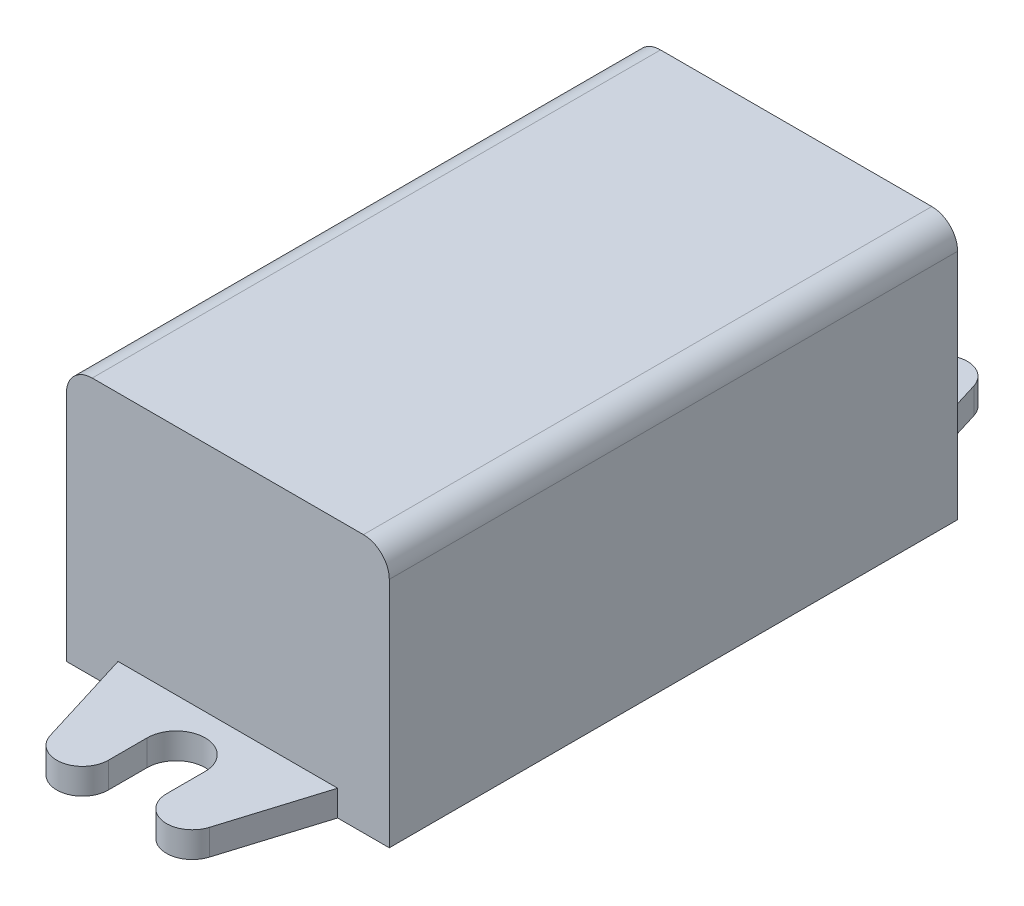
ISO-10303-21;
HEADER;
FILE_DESCRIPTION(('STEP AP214'),'2;1');
FILE_NAME('part.step','',(''),(''),'','','');
FILE_SCHEMA(('AUTOMOTIVE_DESIGN { 1 0 10303 214 1 1 1 1 }'));
ENDSEC;
DATA;
#1=APPLICATION_CONTEXT('core data for automotive mechanical design processes');
#2=APPLICATION_PROTOCOL_DEFINITION('international standard','automotive_design',2000,#1);
#3=PRODUCT_CONTEXT('',#1,'mechanical');
#4=PRODUCT('Part','Part','',(#3));
#5=PRODUCT_RELATED_PRODUCT_CATEGORY('part','',(#4));
#6=PRODUCT_DEFINITION_FORMATION('','',#4);
#7=PRODUCT_DEFINITION_CONTEXT('part definition',#1,'design');
#8=PRODUCT_DEFINITION('design','',#6,#7);
#9=PRODUCT_DEFINITION_SHAPE('','',#8);
#10=(LENGTH_UNIT() NAMED_UNIT(*) SI_UNIT(.MILLI.,.METRE.));
#11=(NAMED_UNIT(*) PLANE_ANGLE_UNIT() SI_UNIT($,.RADIAN.));
#12=(NAMED_UNIT(*) SI_UNIT($,.STERADIAN.) SOLID_ANGLE_UNIT());
#13=UNCERTAINTY_MEASURE_WITH_UNIT(LENGTH_MEASURE(1.E-05),#10,'distance_accuracy_value','');
#14=(GEOMETRIC_REPRESENTATION_CONTEXT(3) GLOBAL_UNCERTAINTY_ASSIGNED_CONTEXT((#13)) GLOBAL_UNIT_ASSIGNED_CONTEXT((#10,
#11,#12)) REPRESENTATION_CONTEXT('',''));
#15=CARTESIAN_POINT('',(0.,0.,0.));
#16=DIRECTION('',(0.,0.,1.));
#17=DIRECTION('',(1.,0.,0.));
#18=AXIS2_PLACEMENT_3D('',#15,#16,#17);
#19=CARTESIAN_POINT('',(0.,0.,-22.));
#20=DIRECTION('',(0.,0.,1.));
#21=DIRECTION('',(1.,0.,0.));
#22=AXIS2_PLACEMENT_3D('',#19,#20,#21);
#23=PLANE('',#22);
#24=DIRECTION('',(0.,-1.,0.));
#25=VECTOR('',#24,1.);
#26=CARTESIAN_POINT('',(-12.5,10.,-22.));
#27=LINE('',#26,#25);
#28=CARTESIAN_POINT('',(-12.5,8.,-22.));
#29=VERTEX_POINT('',#28);
#30=CARTESIAN_POINT('',(-12.5,-10.,-22.));
#31=VERTEX_POINT('',#30);
#32=EDGE_CURVE('E340',#29,#31,#27,.T.);
#33=ORIENTED_EDGE('',*,*,#32,.F.);
#34=CARTESIAN_POINT('',(-10.5,8.,-22.));
#35=DIRECTION('',(0.,0.,1.));
#36=DIRECTION('',(1.,0.,0.));
#37=AXIS2_PLACEMENT_3D('',#34,#35,#36);
#38=CIRCLE('',#37,2.);
#39=CARTESIAN_POINT('',(-10.5,10.,-22.));
#40=VERTEX_POINT('',#39);
#41=EDGE_CURVE('E355',#29,#40,#38,.F.);
#42=ORIENTED_EDGE('',*,*,#41,.T.);
#43=DIRECTION('',(-1.,0.,0.));
#44=VECTOR('',#43,1.);
#45=CARTESIAN_POINT('',(-12.5,10.,-22.));
#46=LINE('',#45,#44);
#47=CARTESIAN_POINT('',(10.5,10.,-22.));
#48=VERTEX_POINT('',#47);
#49=EDGE_CURVE('E338',#48,#40,#46,.T.);
#50=ORIENTED_EDGE('',*,*,#49,.F.);
#51=CARTESIAN_POINT('',(10.5,8.,-22.));
#52=DIRECTION('',(0.,0.,1.));
#53=DIRECTION('',(1.,0.,0.));
#54=AXIS2_PLACEMENT_3D('',#51,#52,#53);
#55=CIRCLE('',#54,2.);
#56=CARTESIAN_POINT('',(12.5,8.,-22.));
#57=VERTEX_POINT('',#56);
#58=EDGE_CURVE('E353',#48,#57,#55,.F.);
#59=ORIENTED_EDGE('',*,*,#58,.T.);
#60=DIRECTION('',(0.,1.,0.));
#61=VECTOR('',#60,1.);
#62=CARTESIAN_POINT('',(12.5,10.,-22.));
#63=LINE('',#62,#61);
#64=CARTESIAN_POINT('',(12.5,-10.,-22.));
#65=VERTEX_POINT('',#64);
#66=EDGE_CURVE('E310',#65,#57,#63,.T.);
#67=ORIENTED_EDGE('',*,*,#66,.F.);
#68=DIRECTION('',(1.,0.,0.));
#69=VECTOR('',#68,1.);
#70=CARTESIAN_POINT('',(-12.5,-10.,-22.));
#71=LINE('',#70,#69);
#72=CARTESIAN_POINT('',(8.5,-10.,-22.));
#73=VERTEX_POINT('',#72);
#74=EDGE_CURVE('E342',#73,#65,#71,.T.);
#75=ORIENTED_EDGE('',*,*,#74,.F.);
#76=DIRECTION('',(0.,-1.,0.));
#77=VECTOR('',#76,1.);
#78=CARTESIAN_POINT('',(8.5,-8.,-22.));
#79=LINE('',#78,#77);
#80=CARTESIAN_POINT('',(8.5,-8.,-22.));
#81=VERTEX_POINT('',#80);
#82=EDGE_CURVE('E308',#81,#73,#79,.T.);
#83=ORIENTED_EDGE('',*,*,#82,.F.);
#84=DIRECTION('',(-1.,0.,0.));
#85=VECTOR('',#84,1.);
#86=CARTESIAN_POINT('',(-8.5,-8.,-22.));
#87=LINE('',#86,#85);
#88=CARTESIAN_POINT('',(-8.5,-8.,-22.));
#89=VERTEX_POINT('',#88);
#90=EDGE_CURVE('E263',#81,#89,#87,.T.);
#91=ORIENTED_EDGE('',*,*,#90,.T.);
#92=DIRECTION('',(0.,-1.,0.));
#93=VECTOR('',#92,1.);
#94=CARTESIAN_POINT('',(-8.5,-8.,-22.));
#95=LINE('',#94,#93);
#96=CARTESIAN_POINT('',(-8.5,-10.,-22.));
#97=VERTEX_POINT('',#96);
#98=EDGE_CURVE('E288',#89,#97,#95,.T.);
#99=ORIENTED_EDGE('',*,*,#98,.T.);
#100=EDGE_CURVE('E328',#31,#97,#71,.T.);
#101=ORIENTED_EDGE('',*,*,#100,.F.);
#102=EDGE_LOOP('',(#33,#42,#50,#59,#67,#75,#83,#91,#99,#101));
#103=FACE_BOUND('',#102,.T.);
#104=ADVANCED_FACE('F38',(#103),#23,.F.);
#105=CARTESIAN_POINT('',(12.5,10.,22.));
#106=DIRECTION('',(-1.,0.,0.));
#107=DIRECTION('',(0.,0.,1.));
#108=AXIS2_PLACEMENT_3D('',#105,#106,#107);
#109=PLANE('',#108);
#110=ORIENTED_EDGE('',*,*,#66,.T.);
#111=DIRECTION('',(0.,0.,-1.));
#112=VECTOR('',#111,1.);
#113=CARTESIAN_POINT('',(12.5,8.,22.));
#114=LINE('',#113,#112);
#115=CARTESIAN_POINT('',(12.5,8.,22.));
#116=VERTEX_POINT('',#115);
#117=EDGE_CURVE('E11',#57,#116,#114,.F.);
#118=ORIENTED_EDGE('',*,*,#117,.T.);
#119=DIRECTION('',(0.,1.,0.));
#120=VECTOR('',#119,1.);
#121=CARTESIAN_POINT('',(12.5,10.,22.));
#122=LINE('',#121,#120);
#123=CARTESIAN_POINT('',(12.5,-10.,22.));
#124=VERTEX_POINT('',#123);
#125=EDGE_CURVE('E325',#124,#116,#122,.T.);
#126=ORIENTED_EDGE('',*,*,#125,.F.);
#127=DIRECTION('',(0.,0.,-1.));
#128=VECTOR('',#127,1.);
#129=CARTESIAN_POINT('',(12.5,-10.,22.));
#130=LINE('',#129,#128);
#131=EDGE_CURVE('E336',#124,#65,#130,.T.);
#132=ORIENTED_EDGE('',*,*,#131,.T.);
#133=EDGE_LOOP('',(#110,#118,#126,#132));
#134=FACE_BOUND('',#133,.T.);
#135=ADVANCED_FACE('F383',(#134),#109,.F.);
#136=CARTESIAN_POINT('',(-12.5,10.,22.));
#137=DIRECTION('',(0.,-1.,0.));
#138=DIRECTION('',(0.,0.,-1.));
#139=AXIS2_PLACEMENT_3D('',#136,#137,#138);
#140=PLANE('',#139);
#141=ORIENTED_EDGE('',*,*,#49,.T.);
#142=DIRECTION('',(0.,0.,-1.));
#143=VECTOR('',#142,1.);
#144=CARTESIAN_POINT('',(-10.5,10.,22.));
#145=LINE('',#144,#143);
#146=CARTESIAN_POINT('',(-10.5,10.,22.));
#147=VERTEX_POINT('',#146);
#148=EDGE_CURVE('E59',#40,#147,#145,.F.);
#149=ORIENTED_EDGE('',*,*,#148,.T.);
#150=DIRECTION('',(-1.,0.,0.));
#151=VECTOR('',#150,1.);
#152=CARTESIAN_POINT('',(-12.5,10.,22.));
#153=LINE('',#152,#151);
#154=CARTESIAN_POINT('',(10.5,10.,22.));
#155=VERTEX_POINT('',#154);
#156=EDGE_CURVE('E327',#155,#147,#153,.T.);
#157=ORIENTED_EDGE('',*,*,#156,.F.);
#158=DIRECTION('',(0.,0.,-1.));
#159=VECTOR('',#158,1.);
#160=CARTESIAN_POINT('',(10.5,10.,22.));
#161=LINE('',#160,#159);
#162=EDGE_CURVE('E357',#155,#48,#161,.T.);
#163=ORIENTED_EDGE('',*,*,#162,.T.);
#164=EDGE_LOOP('',(#141,#149,#157,#163));
#165=FACE_BOUND('',#164,.T.);
#166=ADVANCED_FACE('F377',(#165),#140,.F.);
#167=CARTESIAN_POINT('',(-12.5,10.,22.));
#168=DIRECTION('',(1.,0.,0.));
#169=DIRECTION('',(0.,0.,-1.));
#170=AXIS2_PLACEMENT_3D('',#167,#168,#169);
#171=PLANE('',#170);
#172=DIRECTION('',(0.,-1.,0.));
#173=VECTOR('',#172,1.);
#174=CARTESIAN_POINT('',(-12.5,10.,22.));
#175=LINE('',#174,#173);
#176=CARTESIAN_POINT('',(-12.5,8.,22.));
#177=VERTEX_POINT('',#176);
#178=CARTESIAN_POINT('',(-12.5,-10.,22.));
#179=VERTEX_POINT('',#178);
#180=EDGE_CURVE('E330',#177,#179,#175,.T.);
#181=ORIENTED_EDGE('',*,*,#180,.F.);
#182=DIRECTION('',(0.,0.,-1.));
#183=VECTOR('',#182,1.);
#184=CARTESIAN_POINT('',(-12.5,8.,22.));
#185=LINE('',#184,#183);
#186=EDGE_CURVE('E350',#177,#29,#185,.T.);
#187=ORIENTED_EDGE('',*,*,#186,.T.);
#188=ORIENTED_EDGE('',*,*,#32,.T.);
#189=DIRECTION('',(0.,0.,-1.));
#190=VECTOR('',#189,1.);
#191=CARTESIAN_POINT('',(-12.5,-10.,22.));
#192=LINE('',#191,#190);
#193=EDGE_CURVE('E347',#179,#31,#192,.T.);
#194=ORIENTED_EDGE('',*,*,#193,.F.);
#195=EDGE_LOOP('',(#181,#187,#188,#194));
#196=FACE_BOUND('',#195,.T.);
#197=ADVANCED_FACE('F370',(#196),#171,.F.);
#198=CARTESIAN_POINT('',(-12.5,-10.,22.));
#199=DIRECTION('',(0.,1.,0.));
#200=DIRECTION('',(-1.,0.,0.));
#201=AXIS2_PLACEMENT_3D('',#198,#199,#200);
#202=PLANE('',#201);
#203=ORIENTED_EDGE('',*,*,#100,.T.);
#204=DIRECTION('',(0.294502260880833,0.,-0.955650782627251));
#205=VECTOR('',#204,1.);
#206=CARTESIAN_POINT('',(-8.5,-10.,-22.));
#207=LINE('',#206,#205);
#208=CARTESIAN_POINT('',(-6.16130156525449,-10.,-29.5890045217617));
#209=VERTEX_POINT('',#208);
#210=EDGE_CURVE('E250',#97,#209,#207,.T.);
#211=ORIENTED_EDGE('',*,*,#210,.T.);
#212=CARTESIAN_POINT('',(-4.24999999999999,-10.,-29.));
#213=DIRECTION('',(0.,-1.,0.));
#214=DIRECTION('',(1.,0.,0.));
#215=AXIS2_PLACEMENT_3D('',#212,#213,#214);
#216=CIRCLE('',#215,2.);
#217=CARTESIAN_POINT('',(-2.24999999999999,-10.,-29.));
#218=VERTEX_POINT('',#217);
#219=EDGE_CURVE('E291',#209,#218,#216,.T.);
#220=ORIENTED_EDGE('',*,*,#219,.T.);
#221=DIRECTION('',(0.,0.,1.));
#222=VECTOR('',#221,1.);
#223=CARTESIAN_POINT('',(-2.24999999999999,-10.,-29.));
#224=LINE('',#223,#222);
#225=CARTESIAN_POINT('',(-2.24999999999999,-10.,-26.));
#226=VERTEX_POINT('',#225);
#227=EDGE_CURVE('E294',#218,#226,#224,.T.);
#228=ORIENTED_EDGE('',*,*,#227,.T.);
#229=CARTESIAN_POINT('',(0.,-10.,-26.));
#230=DIRECTION('',(0.,1.,0.));
#231=DIRECTION('',(-1.,0.,0.));
#232=AXIS2_PLACEMENT_3D('',#229,#230,#231);
#233=CIRCLE('',#232,2.24999999999999);
#234=CARTESIAN_POINT('',(2.24999999999999,-10.,-26.));
#235=VERTEX_POINT('',#234);
#236=EDGE_CURVE('E297',#226,#235,#233,.T.);
#237=ORIENTED_EDGE('',*,*,#236,.T.);
#238=DIRECTION('',(0.,0.,-1.));
#239=VECTOR('',#238,1.);
#240=CARTESIAN_POINT('',(2.24999999999999,-10.,-29.));
#241=LINE('',#240,#239);
#242=CARTESIAN_POINT('',(2.24999999999999,-10.,-29.));
#243=VERTEX_POINT('',#242);
#244=EDGE_CURVE('E300',#235,#243,#241,.T.);
#245=ORIENTED_EDGE('',*,*,#244,.T.);
#246=CARTESIAN_POINT('',(4.24999999999999,-10.,-29.));
#247=DIRECTION('',(0.,-1.,0.));
#248=DIRECTION('',(-1.,0.,0.));
#249=AXIS2_PLACEMENT_3D('',#246,#247,#248);
#250=CIRCLE('',#249,2.);
#251=CARTESIAN_POINT('',(6.16130156525449,-10.,-29.5890045217617));
#252=VERTEX_POINT('',#251);
#253=EDGE_CURVE('E303',#243,#252,#250,.T.);
#254=ORIENTED_EDGE('',*,*,#253,.T.);
#255=DIRECTION('',(0.294502260880833,0.,0.955650782627251));
#256=VECTOR('',#255,1.);
#257=CARTESIAN_POINT('',(8.5,-10.,-22.));
#258=LINE('',#257,#256);
#259=EDGE_CURVE('E267',#252,#73,#258,.T.);
#260=ORIENTED_EDGE('',*,*,#259,.T.);
#261=ORIENTED_EDGE('',*,*,#74,.T.);
#262=ORIENTED_EDGE('',*,*,#131,.F.);
#263=DIRECTION('',(1.,0.,0.));
#264=VECTOR('',#263,1.);
#265=CARTESIAN_POINT('',(-12.5,-10.,22.));
#266=LINE('',#265,#264);
#267=CARTESIAN_POINT('',(8.5,-10.,22.));
#268=VERTEX_POINT('',#267);
#269=EDGE_CURVE('E332',#268,#124,#266,.T.);
#270=ORIENTED_EDGE('',*,*,#269,.F.);
#271=DIRECTION('',(-0.294502260880833,0.,0.955650782627251));
#272=VECTOR('',#271,1.);
#273=CARTESIAN_POINT('',(8.5,-10.,22.));
#274=LINE('',#273,#272);
#275=CARTESIAN_POINT('',(6.16130156525449,-10.,29.5890045217617));
#276=VERTEX_POINT('',#275);
#277=EDGE_CURVE('E215',#268,#276,#274,.T.);
#278=ORIENTED_EDGE('',*,*,#277,.T.);
#279=CARTESIAN_POINT('',(4.24999999999999,-10.,29.));
#280=DIRECTION('',(0.,-1.,0.));
#281=DIRECTION('',(1.,0.,0.));
#282=AXIS2_PLACEMENT_3D('',#279,#280,#281);
#283=CIRCLE('',#282,2.);
#284=CARTESIAN_POINT('',(2.24999999999999,-10.,29.));
#285=VERTEX_POINT('',#284);
#286=EDGE_CURVE('E235',#276,#285,#283,.T.);
#287=ORIENTED_EDGE('',*,*,#286,.T.);
#288=DIRECTION('',(0.,0.,-1.));
#289=VECTOR('',#288,1.);
#290=CARTESIAN_POINT('',(2.24999999999999,-10.,29.));
#291=LINE('',#290,#289);
#292=CARTESIAN_POINT('',(2.24999999999999,-10.,26.));
#293=VERTEX_POINT('',#292);
#294=EDGE_CURVE('E194',#285,#293,#291,.T.);
#295=ORIENTED_EDGE('',*,*,#294,.T.);
#296=CARTESIAN_POINT('',(0.,-10.,26.));
#297=DIRECTION('',(0.,1.,0.));
#298=DIRECTION('',(1.,0.,0.));
#299=AXIS2_PLACEMENT_3D('',#296,#297,#298);
#300=CIRCLE('',#299,2.24999999999999);
#301=CARTESIAN_POINT('',(-2.24999999999999,-10.,26.));
#302=VERTEX_POINT('',#301);
#303=EDGE_CURVE('E238',#293,#302,#300,.T.);
#304=ORIENTED_EDGE('',*,*,#303,.T.);
#305=DIRECTION('',(0.,0.,1.));
#306=VECTOR('',#305,1.);
#307=CARTESIAN_POINT('',(-2.24999999999999,-10.,29.));
#308=LINE('',#307,#306);
#309=CARTESIAN_POINT('',(-2.24999999999999,-10.,29.));
#310=VERTEX_POINT('',#309);
#311=EDGE_CURVE('E241',#302,#310,#308,.T.);
#312=ORIENTED_EDGE('',*,*,#311,.T.);
#313=CARTESIAN_POINT('',(-4.24999999999999,-10.,29.));
#314=DIRECTION('',(0.,-1.,0.));
#315=DIRECTION('',(-1.,0.,0.));
#316=AXIS2_PLACEMENT_3D('',#313,#314,#315);
#317=CIRCLE('',#316,2.);
#318=CARTESIAN_POINT('',(-6.16130156525449,-10.,29.5890045217617));
#319=VERTEX_POINT('',#318);
#320=EDGE_CURVE('E244',#310,#319,#317,.T.);
#321=ORIENTED_EDGE('',*,*,#320,.T.);
#322=DIRECTION('',(-0.294502260880833,0.,-0.955650782627251));
#323=VECTOR('',#322,1.);
#324=CARTESIAN_POINT('',(-8.5,-10.,22.));
#325=LINE('',#324,#323);
#326=CARTESIAN_POINT('',(-8.5,-10.,22.));
#327=VERTEX_POINT('',#326);
#328=EDGE_CURVE('E218',#319,#327,#325,.T.);
#329=ORIENTED_EDGE('',*,*,#328,.T.);
#330=EDGE_CURVE('E333',#179,#327,#266,.T.);
#331=ORIENTED_EDGE('',*,*,#330,.F.);
#332=ORIENTED_EDGE('',*,*,#193,.T.);
#333=EDGE_LOOP('',(#203,#211,#220,#228,#237,#245,#254,#260,#261,#262,#270,#278,#287,#295,#304,
#312,#321,#329,#331,#332));
#334=FACE_BOUND('',#333,.T.);
#335=ADVANCED_FACE('F387',(#334),#202,.F.);
#336=CARTESIAN_POINT('',(0.,0.,22.));
#337=DIRECTION('',(0.,0.,1.));
#338=DIRECTION('',(1.,0.,0.));
#339=AXIS2_PLACEMENT_3D('',#336,#337,#338);
#340=PLANE('',#339);
#341=ORIENTED_EDGE('',*,*,#156,.T.);
#342=CARTESIAN_POINT('',(-10.5,8.,22.));
#343=DIRECTION('',(0.,0.,1.));
#344=DIRECTION('',(1.,0.,0.));
#345=AXIS2_PLACEMENT_3D('',#342,#343,#344);
#346=CIRCLE('',#345,2.);
#347=EDGE_CURVE('E46',#147,#177,#346,.T.);
#348=ORIENTED_EDGE('',*,*,#347,.T.);
#349=ORIENTED_EDGE('',*,*,#180,.T.);
#350=ORIENTED_EDGE('',*,*,#330,.T.);
#351=DIRECTION('',(0.,-1.,0.));
#352=VECTOR('',#351,1.);
#353=CARTESIAN_POINT('',(-8.5,-8.,22.));
#354=LINE('',#353,#352);
#355=CARTESIAN_POINT('',(-8.5,-8.,22.));
#356=VERTEX_POINT('',#355);
#357=EDGE_CURVE('E254',#356,#327,#354,.T.);
#358=ORIENTED_EDGE('',*,*,#357,.F.);
#359=DIRECTION('',(1.,0.,0.));
#360=VECTOR('',#359,1.);
#361=CARTESIAN_POINT('',(-8.5,-8.,22.));
#362=LINE('',#361,#360);
#363=CARTESIAN_POINT('',(8.5,-8.,22.));
#364=VERTEX_POINT('',#363);
#365=EDGE_CURVE('E231',#356,#364,#362,.T.);
#366=ORIENTED_EDGE('',*,*,#365,.T.);
#367=DIRECTION('',(0.,-1.,0.));
#368=VECTOR('',#367,1.);
#369=CARTESIAN_POINT('',(8.5,-8.,22.));
#370=LINE('',#369,#368);
#371=EDGE_CURVE('E251',#364,#268,#370,.T.);
#372=ORIENTED_EDGE('',*,*,#371,.T.);
#373=ORIENTED_EDGE('',*,*,#269,.T.);
#374=ORIENTED_EDGE('',*,*,#125,.T.);
#375=CARTESIAN_POINT('',(10.5,8.,22.));
#376=DIRECTION('',(0.,0.,1.));
#377=DIRECTION('',(1.,0.,0.));
#378=AXIS2_PLACEMENT_3D('',#375,#376,#377);
#379=CIRCLE('',#378,2.);
#380=EDGE_CURVE('E361',#116,#155,#379,.T.);
#381=ORIENTED_EDGE('',*,*,#380,.T.);
#382=EDGE_LOOP('',(#341,#348,#349,#350,#358,#366,#372,#373,#374,#381));
#383=FACE_BOUND('',#382,.T.);
#384=ADVANCED_FACE('F365',(#383),#340,.T.);
#385=CARTESIAN_POINT('',(8.5,-8.,-22.));
#386=DIRECTION('',(0.955650782627251,0.,-0.294502260880833));
#387=DIRECTION('',(-0.294502260880833,0.,-0.955650782627251));
#388=AXIS2_PLACEMENT_3D('',#385,#386,#387);
#389=PLANE('',#388);
#390=ORIENTED_EDGE('',*,*,#259,.F.);
#391=DIRECTION('',(0.,-1.,0.));
#392=VECTOR('',#391,1.);
#393=CARTESIAN_POINT('',(6.16130156525449,-8.,-29.5890045217617));
#394=LINE('',#393,#392);
#395=CARTESIAN_POINT('',(6.16130156525449,-8.,-29.5890045217617));
#396=VERTEX_POINT('',#395);
#397=EDGE_CURVE('E311',#396,#252,#394,.T.);
#398=ORIENTED_EDGE('',*,*,#397,.F.);
#399=DIRECTION('',(0.294502260880833,0.,0.955650782627251));
#400=VECTOR('',#399,1.);
#401=CARTESIAN_POINT('',(8.5,-8.,-22.));
#402=LINE('',#401,#400);
#403=EDGE_CURVE('E285',#396,#81,#402,.T.);
#404=ORIENTED_EDGE('',*,*,#403,.T.);
#405=ORIENTED_EDGE('',*,*,#82,.T.);
#406=EDGE_LOOP('',(#390,#398,#404,#405));
#407=FACE_BOUND('',#406,.T.);
#408=ADVANCED_FACE('F391',(#407),#389,.T.);
#409=CARTESIAN_POINT('',(4.24999999999999,-8.,-29.));
#410=DIRECTION('',(0.,-1.,0.));
#411=DIRECTION('',(1.,0.,0.));
#412=AXIS2_PLACEMENT_3D('',#409,#410,#411);
#413=CYLINDRICAL_SURFACE('',#412,2.);
#414=ORIENTED_EDGE('',*,*,#253,.F.);
#415=DIRECTION('',(0.,-1.,0.));
#416=VECTOR('',#415,1.);
#417=CARTESIAN_POINT('',(2.24999999999999,-8.,-29.));
#418=LINE('',#417,#416);
#419=CARTESIAN_POINT('',(2.24999999999999,-8.,-29.));
#420=VERTEX_POINT('',#419);
#421=EDGE_CURVE('E313',#420,#243,#418,.T.);
#422=ORIENTED_EDGE('',*,*,#421,.F.);
#423=CARTESIAN_POINT('',(4.24999999999999,-8.,-29.));
#424=DIRECTION('',(0.,-1.,0.));
#425=DIRECTION('',(-1.,0.,0.));
#426=AXIS2_PLACEMENT_3D('',#423,#424,#425);
#427=CIRCLE('',#426,2.);
#428=EDGE_CURVE('E282',#420,#396,#427,.T.);
#429=ORIENTED_EDGE('',*,*,#428,.T.);
#430=ORIENTED_EDGE('',*,*,#397,.T.);
#431=EDGE_LOOP('',(#414,#422,#429,#430));
#432=FACE_BOUND('',#431,.T.);
#433=ADVANCED_FACE('F462',(#432),#413,.T.);
#434=CARTESIAN_POINT('',(2.24999999999999,-8.,-29.));
#435=DIRECTION('',(-1.,0.,0.));
#436=DIRECTION('',(0.,0.,1.));
#437=AXIS2_PLACEMENT_3D('',#434,#435,#436);
#438=PLANE('',#437);
#439=ORIENTED_EDGE('',*,*,#244,.F.);
#440=DIRECTION('',(0.,-1.,0.));
#441=VECTOR('',#440,1.);
#442=CARTESIAN_POINT('',(2.24999999999999,-8.,-26.));
#443=LINE('',#442,#441);
#444=CARTESIAN_POINT('',(2.24999999999999,-8.,-26.));
#445=VERTEX_POINT('',#444);
#446=EDGE_CURVE('E315',#445,#235,#443,.T.);
#447=ORIENTED_EDGE('',*,*,#446,.F.);
#448=DIRECTION('',(0.,0.,-1.));
#449=VECTOR('',#448,1.);
#450=CARTESIAN_POINT('',(2.24999999999999,-8.,-29.));
#451=LINE('',#450,#449);
#452=EDGE_CURVE('E279',#445,#420,#451,.T.);
#453=ORIENTED_EDGE('',*,*,#452,.T.);
#454=ORIENTED_EDGE('',*,*,#421,.T.);
#455=EDGE_LOOP('',(#439,#447,#453,#454));
#456=FACE_BOUND('',#455,.T.);
#457=ADVANCED_FACE('F465',(#456),#438,.T.);
#458=CARTESIAN_POINT('',(0.,-8.,-26.));
#459=DIRECTION('',(0.,-1.,0.));
#460=DIRECTION('',(1.,0.,0.));
#461=AXIS2_PLACEMENT_3D('',#458,#459,#460);
#462=CYLINDRICAL_SURFACE('',#461,2.24999999999999);
#463=ORIENTED_EDGE('',*,*,#236,.F.);
#464=DIRECTION('',(0.,-1.,0.));
#465=VECTOR('',#464,1.);
#466=CARTESIAN_POINT('',(-2.24999999999999,-8.,-26.));
#467=LINE('',#466,#465);
#468=CARTESIAN_POINT('',(-2.24999999999999,-8.,-26.));
#469=VERTEX_POINT('',#468);
#470=EDGE_CURVE('E317',#469,#226,#467,.T.);
#471=ORIENTED_EDGE('',*,*,#470,.F.);
#472=CARTESIAN_POINT('',(0.,-8.,-26.));
#473=DIRECTION('',(0.,1.,0.));
#474=DIRECTION('',(-1.,0.,0.));
#475=AXIS2_PLACEMENT_3D('',#472,#473,#474);
#476=CIRCLE('',#475,2.24999999999999);
#477=EDGE_CURVE('E276',#469,#445,#476,.T.);
#478=ORIENTED_EDGE('',*,*,#477,.T.);
#479=ORIENTED_EDGE('',*,*,#446,.T.);
#480=EDGE_LOOP('',(#463,#471,#478,#479));
#481=FACE_BOUND('',#480,.T.);
#482=ADVANCED_FACE('F469',(#481),#462,.F.);
#483=CARTESIAN_POINT('',(-2.24999999999999,-8.,-29.));
#484=DIRECTION('',(1.,0.,0.));
#485=DIRECTION('',(0.,0.,-1.));
#486=AXIS2_PLACEMENT_3D('',#483,#484,#485);
#487=PLANE('',#486);
#488=ORIENTED_EDGE('',*,*,#227,.F.);
#489=DIRECTION('',(0.,-1.,0.));
#490=VECTOR('',#489,1.);
#491=CARTESIAN_POINT('',(-2.24999999999999,-8.,-29.));
#492=LINE('',#491,#490);
#493=CARTESIAN_POINT('',(-2.24999999999999,-8.,-29.));
#494=VERTEX_POINT('',#493);
#495=EDGE_CURVE('E319',#494,#218,#492,.T.);
#496=ORIENTED_EDGE('',*,*,#495,.F.);
#497=DIRECTION('',(0.,0.,1.));
#498=VECTOR('',#497,1.);
#499=CARTESIAN_POINT('',(-2.24999999999999,-8.,-29.));
#500=LINE('',#499,#498);
#501=EDGE_CURVE('E273',#494,#469,#500,.T.);
#502=ORIENTED_EDGE('',*,*,#501,.T.);
#503=ORIENTED_EDGE('',*,*,#470,.T.);
#504=EDGE_LOOP('',(#488,#496,#502,#503));
#505=FACE_BOUND('',#504,.T.);
#506=ADVANCED_FACE('F473',(#505),#487,.T.);
#507=CARTESIAN_POINT('',(-4.24999999999999,-8.,-29.));
#508=DIRECTION('',(0.,-1.,0.));
#509=DIRECTION('',(1.,0.,0.));
#510=AXIS2_PLACEMENT_3D('',#507,#508,#509);
#511=CYLINDRICAL_SURFACE('',#510,2.);
#512=ORIENTED_EDGE('',*,*,#219,.F.);
#513=DIRECTION('',(0.,-1.,0.));
#514=VECTOR('',#513,1.);
#515=CARTESIAN_POINT('',(-6.16130156525449,-8.,-29.5890045217617));
#516=LINE('',#515,#514);
#517=CARTESIAN_POINT('',(-6.16130156525449,-8.,-29.5890045217617));
#518=VERTEX_POINT('',#517);
#519=EDGE_CURVE('E321',#518,#209,#516,.T.);
#520=ORIENTED_EDGE('',*,*,#519,.F.);
#521=CARTESIAN_POINT('',(-4.24999999999999,-8.,-29.));
#522=DIRECTION('',(0.,-1.,0.));
#523=DIRECTION('',(1.,0.,0.));
#524=AXIS2_PLACEMENT_3D('',#521,#522,#523);
#525=CIRCLE('',#524,2.);
#526=EDGE_CURVE('E270',#518,#494,#525,.T.);
#527=ORIENTED_EDGE('',*,*,#526,.T.);
#528=ORIENTED_EDGE('',*,*,#495,.T.);
#529=EDGE_LOOP('',(#512,#520,#527,#528));
#530=FACE_BOUND('',#529,.T.);
#531=ADVANCED_FACE('F477',(#530),#511,.T.);
#532=CARTESIAN_POINT('',(-8.5,-8.,-22.));
#533=DIRECTION('',(-0.955650782627251,0.,-0.294502260880833));
#534=DIRECTION('',(-0.294502260880833,0.,0.955650782627251));
#535=AXIS2_PLACEMENT_3D('',#532,#533,#534);
#536=PLANE('',#535);
#537=ORIENTED_EDGE('',*,*,#210,.F.);
#538=ORIENTED_EDGE('',*,*,#98,.F.);
#539=DIRECTION('',(0.294502260880833,0.,-0.955650782627251));
#540=VECTOR('',#539,1.);
#541=CARTESIAN_POINT('',(-8.5,-8.,-22.));
#542=LINE('',#541,#540);
#543=EDGE_CURVE('E266',#89,#518,#542,.T.);
#544=ORIENTED_EDGE('',*,*,#543,.T.);
#545=ORIENTED_EDGE('',*,*,#519,.T.);
#546=EDGE_LOOP('',(#537,#538,#544,#545));
#547=FACE_BOUND('',#546,.T.);
#548=ADVANCED_FACE('F401',(#547),#536,.T.);
#549=CARTESIAN_POINT('',(4.24999999999999,-8.,-29.));
#550=DIRECTION('',(0.,1.,0.));
#551=DIRECTION('',(-1.,0.,0.));
#552=AXIS2_PLACEMENT_3D('',#549,#550,#551);
#553=PLANE('',#552);
#554=ORIENTED_EDGE('',*,*,#90,.F.);
#555=ORIENTED_EDGE('',*,*,#403,.F.);
#556=ORIENTED_EDGE('',*,*,#428,.F.);
#557=ORIENTED_EDGE('',*,*,#452,.F.);
#558=ORIENTED_EDGE('',*,*,#477,.F.);
#559=ORIENTED_EDGE('',*,*,#501,.F.);
#560=ORIENTED_EDGE('',*,*,#526,.F.);
#561=ORIENTED_EDGE('',*,*,#543,.F.);
#562=EDGE_LOOP('',(#554,#555,#556,#557,#558,#559,#560,#561));
#563=FACE_BOUND('',#562,.T.);
#564=ADVANCED_FACE('F395',(#563),#553,.T.);
#565=CARTESIAN_POINT('',(4.24999999999999,-8.,29.));
#566=DIRECTION('',(0.,-1.,0.));
#567=DIRECTION('',(1.,0.,0.));
#568=AXIS2_PLACEMENT_3D('',#565,#566,#567);
#569=CYLINDRICAL_SURFACE('',#568,2.);
#570=ORIENTED_EDGE('',*,*,#286,.F.);
#571=DIRECTION('',(0.,-1.,0.));
#572=VECTOR('',#571,1.);
#573=CARTESIAN_POINT('',(6.16130156525449,-8.,29.5890045217617));
#574=LINE('',#573,#572);
#575=CARTESIAN_POINT('',(6.16130156525449,-8.,29.5890045217617));
#576=VERTEX_POINT('',#575);
#577=EDGE_CURVE('E214',#576,#276,#574,.T.);
#578=ORIENTED_EDGE('',*,*,#577,.F.);
#579=CARTESIAN_POINT('',(4.24999999999999,-8.,29.));
#580=DIRECTION('',(0.,-1.,0.));
#581=DIRECTION('',(1.,0.,0.));
#582=AXIS2_PLACEMENT_3D('',#579,#580,#581);
#583=CIRCLE('',#582,2.);
#584=CARTESIAN_POINT('',(2.24999999999999,-8.,29.));
#585=VERTEX_POINT('',#584);
#586=EDGE_CURVE('E207',#576,#585,#583,.T.);
#587=ORIENTED_EDGE('',*,*,#586,.T.);
#588=DIRECTION('',(0.,-1.,0.));
#589=VECTOR('',#588,1.);
#590=CARTESIAN_POINT('',(2.24999999999999,-8.,29.));
#591=LINE('',#590,#589);
#592=EDGE_CURVE('E189',#585,#285,#591,.T.);
#593=ORIENTED_EDGE('',*,*,#592,.T.);
#594=EDGE_LOOP('',(#570,#578,#587,#593));
#595=FACE_BOUND('',#594,.T.);
#596=ADVANCED_FACE('F213',(#595),#569,.T.);
#597=CARTESIAN_POINT('',(8.5,-8.,22.));
#598=DIRECTION('',(0.955650782627251,0.,0.294502260880833));
#599=DIRECTION('',(0.294502260880833,0.,-0.955650782627251));
#600=AXIS2_PLACEMENT_3D('',#597,#598,#599);
#601=PLANE('',#600);
#602=ORIENTED_EDGE('',*,*,#277,.F.);
#603=ORIENTED_EDGE('',*,*,#371,.F.);
#604=DIRECTION('',(-0.294502260880833,0.,0.955650782627251));
#605=VECTOR('',#604,1.);
#606=CARTESIAN_POINT('',(8.5,-8.,22.));
#607=LINE('',#606,#605);
#608=EDGE_CURVE('E200',#364,#576,#607,.T.);
#609=ORIENTED_EDGE('',*,*,#608,.T.);
#610=ORIENTED_EDGE('',*,*,#577,.T.);
#611=EDGE_LOOP('',(#602,#603,#609,#610));
#612=FACE_BOUND('',#611,.T.);
#613=ADVANCED_FACE('F419',(#612),#601,.T.);
#614=CARTESIAN_POINT('',(-8.5,-8.,22.));
#615=DIRECTION('',(-0.955650782627251,0.,0.294502260880833));
#616=DIRECTION('',(0.294502260880833,0.,0.955650782627251));
#617=AXIS2_PLACEMENT_3D('',#614,#615,#616);
#618=PLANE('',#617);
#619=ORIENTED_EDGE('',*,*,#328,.F.);
#620=DIRECTION('',(0.,-1.,0.));
#621=VECTOR('',#620,1.);
#622=CARTESIAN_POINT('',(-6.16130156525449,-8.,29.5890045217617));
#623=LINE('',#622,#621);
#624=CARTESIAN_POINT('',(-6.16130156525449,-8.,29.5890045217617));
#625=VERTEX_POINT('',#624);
#626=EDGE_CURVE('E256',#625,#319,#623,.T.);
#627=ORIENTED_EDGE('',*,*,#626,.F.);
#628=DIRECTION('',(-0.294502260880833,0.,-0.955650782627251));
#629=VECTOR('',#628,1.);
#630=CARTESIAN_POINT('',(-8.5,-8.,22.));
#631=LINE('',#630,#629);
#632=EDGE_CURVE('E228',#625,#356,#631,.T.);
#633=ORIENTED_EDGE('',*,*,#632,.T.);
#634=ORIENTED_EDGE('',*,*,#357,.T.);
#635=EDGE_LOOP('',(#619,#627,#633,#634));
#636=FACE_BOUND('',#635,.T.);
#637=ADVANCED_FACE('F406',(#636),#618,.T.);
#638=CARTESIAN_POINT('',(-4.24999999999999,-8.,29.));
#639=DIRECTION('',(0.,-1.,0.));
#640=DIRECTION('',(1.,0.,0.));
#641=AXIS2_PLACEMENT_3D('',#638,#639,#640);
#642=CYLINDRICAL_SURFACE('',#641,2.);
#643=ORIENTED_EDGE('',*,*,#320,.F.);
#644=DIRECTION('',(0.,-1.,0.));
#645=VECTOR('',#644,1.);
#646=CARTESIAN_POINT('',(-2.24999999999999,-8.,29.));
#647=LINE('',#646,#645);
#648=CARTESIAN_POINT('',(-2.24999999999999,-8.,29.));
#649=VERTEX_POINT('',#648);
#650=EDGE_CURVE('E258',#649,#310,#647,.T.);
#651=ORIENTED_EDGE('',*,*,#650,.F.);
#652=CARTESIAN_POINT('',(-4.24999999999999,-8.,29.));
#653=DIRECTION('',(0.,-1.,0.));
#654=DIRECTION('',(-1.,0.,0.));
#655=AXIS2_PLACEMENT_3D('',#652,#653,#654);
#656=CIRCLE('',#655,2.);
#657=EDGE_CURVE('E225',#649,#625,#656,.T.);
#658=ORIENTED_EDGE('',*,*,#657,.T.);
#659=ORIENTED_EDGE('',*,*,#626,.T.);
#660=EDGE_LOOP('',(#643,#651,#658,#659));
#661=FACE_BOUND('',#660,.T.);
#662=ADVANCED_FACE('F411',(#661),#642,.T.);
#663=CARTESIAN_POINT('',(-2.24999999999999,-8.,29.));
#664=DIRECTION('',(1.,0.,0.));
#665=DIRECTION('',(0.,0.,-1.));
#666=AXIS2_PLACEMENT_3D('',#663,#664,#665);
#667=PLANE('',#666);
#668=ORIENTED_EDGE('',*,*,#311,.F.);
#669=DIRECTION('',(0.,-1.,0.));
#670=VECTOR('',#669,1.);
#671=CARTESIAN_POINT('',(-2.24999999999999,-8.,26.));
#672=LINE('',#671,#670);
#673=CARTESIAN_POINT('',(-2.24999999999999,-8.,26.));
#674=VERTEX_POINT('',#673);
#675=EDGE_CURVE('E260',#674,#302,#672,.T.);
#676=ORIENTED_EDGE('',*,*,#675,.F.);
#677=DIRECTION('',(0.,0.,1.));
#678=VECTOR('',#677,1.);
#679=CARTESIAN_POINT('',(-2.24999999999999,-8.,29.));
#680=LINE('',#679,#678);
#681=EDGE_CURVE('E222',#674,#649,#680,.T.);
#682=ORIENTED_EDGE('',*,*,#681,.T.);
#683=ORIENTED_EDGE('',*,*,#650,.T.);
#684=EDGE_LOOP('',(#668,#676,#682,#683));
#685=FACE_BOUND('',#684,.T.);
#686=ADVANCED_FACE('F414',(#685),#667,.T.);
#687=CARTESIAN_POINT('',(0.,-8.,26.));
#688=DIRECTION('',(0.,-1.,0.));
#689=DIRECTION('',(1.,0.,0.));
#690=AXIS2_PLACEMENT_3D('',#687,#688,#689);
#691=CYLINDRICAL_SURFACE('',#690,2.24999999999999);
#692=ORIENTED_EDGE('',*,*,#303,.F.);
#693=DIRECTION('',(0.,-1.,0.));
#694=VECTOR('',#693,1.);
#695=CARTESIAN_POINT('',(2.24999999999999,-8.,26.));
#696=LINE('',#695,#694);
#697=CARTESIAN_POINT('',(2.24999999999999,-8.,26.));
#698=VERTEX_POINT('',#697);
#699=EDGE_CURVE('E199',#698,#293,#696,.T.);
#700=ORIENTED_EDGE('',*,*,#699,.F.);
#701=CARTESIAN_POINT('',(0.,-8.,26.));
#702=DIRECTION('',(0.,1.,0.));
#703=DIRECTION('',(1.,0.,0.));
#704=AXIS2_PLACEMENT_3D('',#701,#702,#703);
#705=CIRCLE('',#704,2.24999999999999);
#706=EDGE_CURVE('E211',#698,#674,#705,.T.);
#707=ORIENTED_EDGE('',*,*,#706,.T.);
#708=ORIENTED_EDGE('',*,*,#675,.T.);
#709=EDGE_LOOP('',(#692,#700,#707,#708));
#710=FACE_BOUND('',#709,.T.);
#711=ADVANCED_FACE('F417',(#710),#691,.F.);
#712=CARTESIAN_POINT('',(2.24999999999999,-8.,29.));
#713=DIRECTION('',(-1.,0.,0.));
#714=DIRECTION('',(0.,0.,1.));
#715=AXIS2_PLACEMENT_3D('',#712,#713,#714);
#716=PLANE('',#715);
#717=ORIENTED_EDGE('',*,*,#294,.F.);
#718=ORIENTED_EDGE('',*,*,#592,.F.);
#719=DIRECTION('',(0.,0.,-1.));
#720=VECTOR('',#719,1.);
#721=CARTESIAN_POINT('',(2.24999999999999,-8.,29.));
#722=LINE('',#721,#720);
#723=EDGE_CURVE('E192',#585,#698,#722,.T.);
#724=ORIENTED_EDGE('',*,*,#723,.T.);
#725=ORIENTED_EDGE('',*,*,#699,.T.);
#726=EDGE_LOOP('',(#717,#718,#724,#725));
#727=FACE_BOUND('',#726,.T.);
#728=ADVANCED_FACE('F191',(#727),#716,.T.);
#729=CARTESIAN_POINT('',(4.24999999999999,-8.,29.));
#730=DIRECTION('',(0.,-1.,0.));
#731=DIRECTION('',(1.,0.,0.));
#732=AXIS2_PLACEMENT_3D('',#729,#730,#731);
#733=PLANE('',#732);
#734=ORIENTED_EDGE('',*,*,#586,.F.);
#735=ORIENTED_EDGE('',*,*,#608,.F.);
#736=ORIENTED_EDGE('',*,*,#365,.F.);
#737=ORIENTED_EDGE('',*,*,#632,.F.);
#738=ORIENTED_EDGE('',*,*,#657,.F.);
#739=ORIENTED_EDGE('',*,*,#681,.F.);
#740=ORIENTED_EDGE('',*,*,#706,.F.);
#741=ORIENTED_EDGE('',*,*,#723,.F.);
#742=EDGE_LOOP('',(#734,#735,#736,#737,#738,#739,#740,#741));
#743=FACE_BOUND('',#742,.T.);
#744=ADVANCED_FACE('F205',(#743),#733,.F.);
#745=CARTESIAN_POINT('',(-10.5,8.,22.));
#746=DIRECTION('',(0.,0.,-1.));
#747=DIRECTION('',(-1.,0.,0.));
#748=AXIS2_PLACEMENT_3D('',#745,#746,#747);
#749=CYLINDRICAL_SURFACE('',#748,2.);
#750=ORIENTED_EDGE('',*,*,#347,.F.);
#751=ORIENTED_EDGE('',*,*,#148,.F.);
#752=ORIENTED_EDGE('',*,*,#41,.F.);
#753=ORIENTED_EDGE('',*,*,#186,.F.);
#754=EDGE_LOOP('',(#750,#751,#752,#753));
#755=FACE_BOUND('',#754,.T.);
#756=ADVANCED_FACE('F373',(#755),#749,.T.);
#757=CARTESIAN_POINT('',(10.5,8.,22.));
#758=DIRECTION('',(0.,0.,-1.));
#759=DIRECTION('',(-1.,0.,0.));
#760=AXIS2_PLACEMENT_3D('',#757,#758,#759);
#761=CYLINDRICAL_SURFACE('',#760,2.);
#762=ORIENTED_EDGE('',*,*,#380,.F.);
#763=ORIENTED_EDGE('',*,*,#117,.F.);
#764=ORIENTED_EDGE('',*,*,#58,.F.);
#765=ORIENTED_EDGE('',*,*,#162,.F.);
#766=EDGE_LOOP('',(#762,#763,#764,#765));
#767=FACE_BOUND('',#766,.T.);
#768=ADVANCED_FACE('F40',(#767),#761,.T.);
#769=CLOSED_SHELL('',(#104,#135,#166,#197,#335,#384,#408,#433,#457,#482,#506,#531,#548,#564,
#596,#613,#637,#662,#686,#711,#728,#744,#756,#768));
#770=MANIFOLD_SOLID_BREP('B2',#769);
#771=ADVANCED_BREP_SHAPE_REPRESENTATION('',(#18,#770),#14);
#772=SHAPE_DEFINITION_REPRESENTATION(#9,#771);
ENDSEC;
END-ISO-10303-21;
